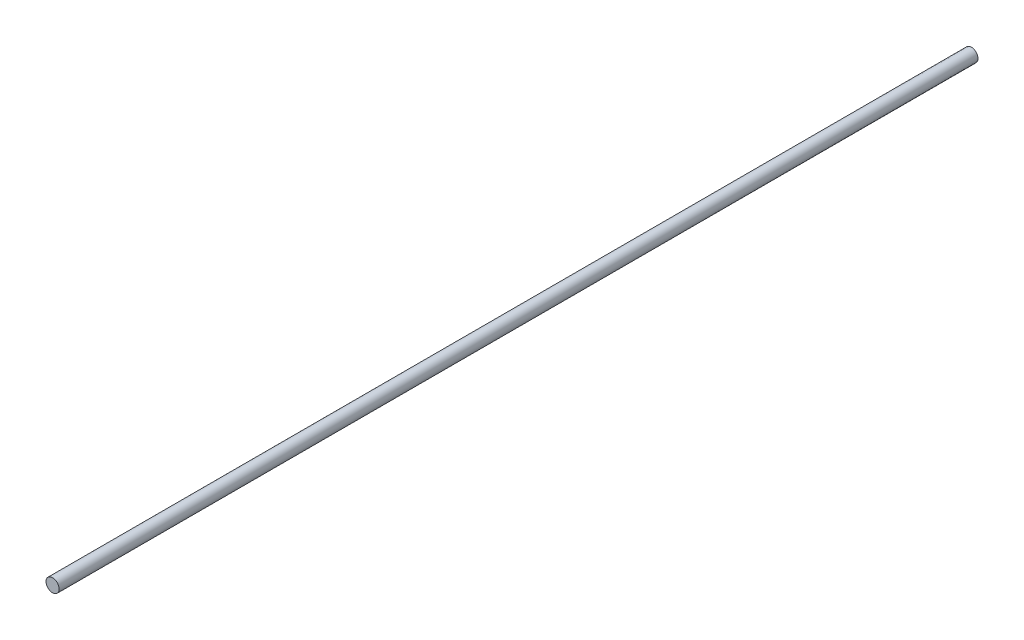
ISO-10303-21;
HEADER;
FILE_DESCRIPTION(('STEP AP214'),'2;1');
FILE_NAME('part.step','',(''),(''),'','','');
FILE_SCHEMA(('AUTOMOTIVE_DESIGN { 1 0 10303 214 1 1 1 1 }'));
ENDSEC;
DATA;
#1=APPLICATION_CONTEXT('core data for automotive mechanical design processes');
#2=APPLICATION_PROTOCOL_DEFINITION('international standard','automotive_design',2000,#1);
#3=PRODUCT_CONTEXT('',#1,'mechanical');
#4=PRODUCT('Part','Part','',(#3));
#5=PRODUCT_RELATED_PRODUCT_CATEGORY('part','',(#4));
#6=PRODUCT_DEFINITION_FORMATION('','',#4);
#7=PRODUCT_DEFINITION_CONTEXT('part definition',#1,'design');
#8=PRODUCT_DEFINITION('design','',#6,#7);
#9=PRODUCT_DEFINITION_SHAPE('','',#8);
#10=(LENGTH_UNIT() NAMED_UNIT(*) SI_UNIT(.MILLI.,.METRE.));
#11=(NAMED_UNIT(*) PLANE_ANGLE_UNIT() SI_UNIT($,.RADIAN.));
#12=(NAMED_UNIT(*) SI_UNIT($,.STERADIAN.) SOLID_ANGLE_UNIT());
#13=UNCERTAINTY_MEASURE_WITH_UNIT(LENGTH_MEASURE(1.E-05),#10,'distance_accuracy_value','');
#14=(GEOMETRIC_REPRESENTATION_CONTEXT(3) GLOBAL_UNCERTAINTY_ASSIGNED_CONTEXT((#13)) GLOBAL_UNIT_ASSIGNED_CONTEXT((#10,
#11,#12)) REPRESENTATION_CONTEXT('',''));
#15=CARTESIAN_POINT('',(0.,0.,0.));
#16=DIRECTION('',(0.,0.,1.));
#17=DIRECTION('',(1.,0.,0.));
#18=AXIS2_PLACEMENT_3D('',#15,#16,#17);
#19=CARTESIAN_POINT('',(0.,0.,700.));
#20=DIRECTION('',(0.,0.,-1.));
#21=DIRECTION('',(-1.,0.,0.));
#22=AXIS2_PLACEMENT_3D('',#19,#20,#21);
#23=CYLINDRICAL_SURFACE('',#22,5.);
#24=CARTESIAN_POINT('',(0.,0.,700.));
#25=DIRECTION('',(0.,0.,1.));
#26=DIRECTION('',(1.,0.,0.));
#27=AXIS2_PLACEMENT_3D('',#24,#25,#26);
#28=CIRCLE('',#27,5.);
#29=CARTESIAN_POINT('',(5.,0.,700.));
#30=VERTEX_POINT('',#29);
#31=EDGE_CURVE('E10',#30,#30,#28,.T.);
#32=ORIENTED_EDGE('',*,*,#31,.F.);
#33=EDGE_LOOP('',(#32));
#34=FACE_BOUND('',#33,.T.);
#35=CARTESIAN_POINT('',(0.,0.,0.));
#36=DIRECTION('',(0.,0.,1.));
#37=DIRECTION('',(1.,0.,0.));
#38=AXIS2_PLACEMENT_3D('',#35,#36,#37);
#39=CIRCLE('',#38,5.);
#40=CARTESIAN_POINT('',(5.,0.,0.));
#41=VERTEX_POINT('',#40);
#42=EDGE_CURVE('E44',#41,#41,#39,.T.);
#43=ORIENTED_EDGE('',*,*,#42,.T.);
#44=EDGE_LOOP('',(#43));
#45=FACE_BOUND('',#44,.T.);
#46=ADVANCED_FACE('F41',(#34,#45),#23,.T.);
#47=CARTESIAN_POINT('',(0.,0.,700.));
#48=DIRECTION('',(0.,0.,1.));
#49=DIRECTION('',(1.,0.,0.));
#50=AXIS2_PLACEMENT_3D('',#47,#48,#49);
#51=PLANE('',#50);
#52=ORIENTED_EDGE('',*,*,#31,.T.);
#53=EDGE_LOOP('',(#52));
#54=FACE_BOUND('',#53,.T.);
#55=ADVANCED_FACE('F58',(#54),#51,.T.);
#56=CARTESIAN_POINT('',(0.,0.,0.));
#57=DIRECTION('',(0.,0.,1.));
#58=DIRECTION('',(1.,0.,0.));
#59=AXIS2_PLACEMENT_3D('',#56,#57,#58);
#60=PLANE('',#59);
#61=ORIENTED_EDGE('',*,*,#42,.F.);
#62=EDGE_LOOP('',(#61));
#63=FACE_BOUND('',#62,.T.);
#64=ADVANCED_FACE('F56',(#63),#60,.F.);
#65=CLOSED_SHELL('',(#46,#55,#64));
#66=MANIFOLD_SOLID_BREP('B2',#65);
#67=ADVANCED_BREP_SHAPE_REPRESENTATION('',(#18,#66),#14);
#68=SHAPE_DEFINITION_REPRESENTATION(#9,#67);
ENDSEC;
END-ISO-10303-21;
